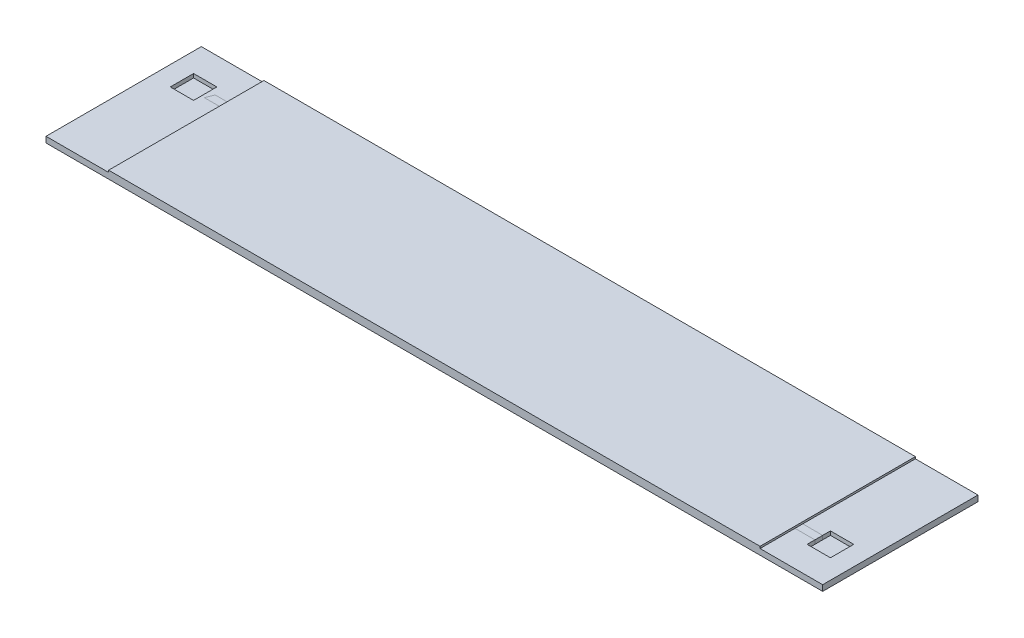
ISO-10303-21;
HEADER;
FILE_DESCRIPTION(('STEP AP214'),'2;1');
FILE_NAME('part.step','',(''),(''),'','','');
FILE_SCHEMA(('AUTOMOTIVE_DESIGN { 1 0 10303 214 1 1 1 1 }'));
ENDSEC;
DATA;
#1=APPLICATION_CONTEXT('core data for automotive mechanical design processes');
#2=APPLICATION_PROTOCOL_DEFINITION('international standard','automotive_design',2000,#1);
#3=PRODUCT_CONTEXT('',#1,'mechanical');
#4=PRODUCT('Part','Part','',(#3));
#5=PRODUCT_RELATED_PRODUCT_CATEGORY('part','',(#4));
#6=PRODUCT_DEFINITION_FORMATION('','',#4);
#7=PRODUCT_DEFINITION_CONTEXT('part definition',#1,'design');
#8=PRODUCT_DEFINITION('design','',#6,#7);
#9=PRODUCT_DEFINITION_SHAPE('','',#8);
#10=(LENGTH_UNIT() NAMED_UNIT(*) SI_UNIT(.MILLI.,.METRE.));
#11=(NAMED_UNIT(*) PLANE_ANGLE_UNIT() SI_UNIT($,.RADIAN.));
#12=(NAMED_UNIT(*) SI_UNIT($,.STERADIAN.) SOLID_ANGLE_UNIT());
#13=UNCERTAINTY_MEASURE_WITH_UNIT(LENGTH_MEASURE(1.E-05),#10,'distance_accuracy_value','');
#14=(GEOMETRIC_REPRESENTATION_CONTEXT(3) GLOBAL_UNCERTAINTY_ASSIGNED_CONTEXT((#13)) GLOBAL_UNIT_ASSIGNED_CONTEXT((#10,
#11,#12)) REPRESENTATION_CONTEXT('',''));
#15=CARTESIAN_POINT('',(0.,0.,0.));
#16=DIRECTION('',(0.,0.,1.));
#17=DIRECTION('',(1.,0.,0.));
#18=AXIS2_PLACEMENT_3D('',#15,#16,#17);
#19=CARTESIAN_POINT('',(-40.65,-0.25,4.50000000000002));
#20=DIRECTION('',(0.,0.,-1.));
#21=DIRECTION('',(-1.,0.,0.));
#22=AXIS2_PLACEMENT_3D('',#19,#20,#21);
#23=PLANE('',#22);
#24=DIRECTION('',(0.,1.,0.));
#25=VECTOR('',#24,1.);
#26=CARTESIAN_POINT('',(44.5,-0.25,4.50000000000002));
#27=LINE('',#26,#25);
#28=CARTESIAN_POINT('',(44.5,-0.25,4.50000000000002));
#29=VERTEX_POINT('',#28);
#30=CARTESIAN_POINT('',(44.5,0.25,4.50000000000002));
#31=VERTEX_POINT('',#30);
#32=EDGE_CURVE('E282',#29,#31,#27,.T.);
#33=ORIENTED_EDGE('',*,*,#32,.F.);
#34=DIRECTION('',(1.,0.,0.));
#35=VECTOR('',#34,1.);
#36=CARTESIAN_POINT('',(-40.65,-0.25,4.50000000000002));
#37=LINE('',#36,#35);
#38=CARTESIAN_POINT('',(-39.5,-0.25,4.50000000000002));
#39=VERTEX_POINT('',#38);
#40=EDGE_CURVE('E267',#39,#29,#37,.T.);
#41=ORIENTED_EDGE('',*,*,#40,.F.);
#42=DIRECTION('',(0.,-1.,0.));
#43=VECTOR('',#42,1.);
#44=CARTESIAN_POINT('',(-39.5,-0.25,4.50000000000002));
#45=LINE('',#44,#43);
#46=CARTESIAN_POINT('',(-39.5,0.25,4.50000000000002));
#47=VERTEX_POINT('',#46);
#48=EDGE_CURVE('E262',#47,#39,#45,.T.);
#49=ORIENTED_EDGE('',*,*,#48,.F.);
#50=DIRECTION('',(1.,0.,0.));
#51=VECTOR('',#50,1.);
#52=CARTESIAN_POINT('',(-40.65,0.25,4.50000000000002));
#53=LINE('',#52,#51);
#54=EDGE_CURVE('E284',#47,#31,#53,.T.);
#55=ORIENTED_EDGE('',*,*,#54,.T.);
#56=EDGE_LOOP('',(#33,#41,#49,#55));
#57=FACE_BOUND('',#56,.T.);
#58=ADVANCED_FACE('F45',(#57),#23,.T.);
#59=CARTESIAN_POINT('',(-40.65,0.25,5.50000000000002));
#60=DIRECTION('',(0.,1.,0.));
#61=DIRECTION('',(0.,0.,1.));
#62=AXIS2_PLACEMENT_3D('',#59,#60,#61);
#63=PLANE('',#62);
#64=DIRECTION('',(0.,0.,1.));
#65=VECTOR('',#64,1.);
#66=CARTESIAN_POINT('',(44.5,0.25,5.50000000000002));
#67=LINE('',#66,#65);
#68=CARTESIAN_POINT('',(44.5,0.25,5.50000000000002));
#69=VERTEX_POINT('',#68);
#70=EDGE_CURVE('E393',#31,#69,#67,.T.);
#71=ORIENTED_EDGE('',*,*,#70,.F.);
#72=ORIENTED_EDGE('',*,*,#54,.F.);
#73=DIRECTION('',(0.707106781186548,0.,-0.707106781186548));
#74=VECTOR('',#73,1.);
#75=CARTESIAN_POINT('',(-37.425,0.25,2.42500000000002));
#76=LINE('',#75,#74);
#77=CARTESIAN_POINT('',(-40.5,0.25,5.50000000000002));
#78=VERTEX_POINT('',#77);
#79=EDGE_CURVE('E243',#78,#47,#76,.T.);
#80=ORIENTED_EDGE('',*,*,#79,.F.);
#81=DIRECTION('',(1.,0.,0.));
#82=VECTOR('',#81,1.);
#83=CARTESIAN_POINT('',(-40.65,0.25,5.50000000000002));
#84=LINE('',#83,#82);
#85=EDGE_CURVE('E281',#78,#69,#84,.T.);
#86=ORIENTED_EDGE('',*,*,#85,.T.);
#87=EDGE_LOOP('',(#71,#72,#80,#86));
#88=FACE_BOUND('',#87,.T.);
#89=ADVANCED_FACE('F383',(#88),#63,.T.);
#90=CARTESIAN_POINT('',(-40.65,-0.25,5.50000000000002));
#91=DIRECTION('',(0.,0.,1.));
#92=DIRECTION('',(1.,0.,0.));
#93=AXIS2_PLACEMENT_3D('',#90,#91,#92);
#94=PLANE('',#93);
#95=DIRECTION('',(0.,-1.,0.));
#96=VECTOR('',#95,1.);
#97=CARTESIAN_POINT('',(44.5,-0.25,5.50000000000002));
#98=LINE('',#97,#96);
#99=CARTESIAN_POINT('',(44.5,-0.25,5.50000000000002));
#100=VERTEX_POINT('',#99);
#101=EDGE_CURVE('E59',#69,#100,#98,.T.);
#102=ORIENTED_EDGE('',*,*,#101,.F.);
#103=ORIENTED_EDGE('',*,*,#85,.F.);
#104=DIRECTION('',(0.,1.,0.));
#105=VECTOR('',#104,1.);
#106=CARTESIAN_POINT('',(-40.5,-0.25,5.50000000000002));
#107=LINE('',#106,#105);
#108=CARTESIAN_POINT('',(-40.5,-0.25,5.50000000000002));
#109=VERTEX_POINT('',#108);
#110=EDGE_CURVE('E256',#109,#78,#107,.T.);
#111=ORIENTED_EDGE('',*,*,#110,.F.);
#112=DIRECTION('',(1.,0.,0.));
#113=VECTOR('',#112,1.);
#114=CARTESIAN_POINT('',(-40.65,-0.25,5.50000000000002));
#115=LINE('',#114,#113);
#116=EDGE_CURVE('E278',#109,#100,#115,.T.);
#117=ORIENTED_EDGE('',*,*,#116,.T.);
#118=EDGE_LOOP('',(#102,#103,#111,#117));
#119=FACE_BOUND('',#118,.T.);
#120=ADVANCED_FACE('F385',(#119),#94,.T.);
#121=CARTESIAN_POINT('',(-40.65,-0.25,5.50000000000002));
#122=DIRECTION('',(0.,-1.,0.));
#123=DIRECTION('',(0.,0.,-1.));
#124=AXIS2_PLACEMENT_3D('',#121,#122,#123);
#125=PLANE('',#124);
#126=DIRECTION('',(0.,0.,-1.));
#127=VECTOR('',#126,1.);
#128=CARTESIAN_POINT('',(44.5,-0.25,5.50000000000002));
#129=LINE('',#128,#127);
#130=EDGE_CURVE('E12',#100,#29,#129,.T.);
#131=ORIENTED_EDGE('',*,*,#130,.F.);
#132=ORIENTED_EDGE('',*,*,#116,.F.);
#133=DIRECTION('',(-0.707106781186548,0.,0.707106781186548));
#134=VECTOR('',#133,1.);
#135=CARTESIAN_POINT('',(-37.425,-0.25,2.42500000000002));
#136=LINE('',#135,#134);
#137=EDGE_CURVE('E259',#39,#109,#136,.T.);
#138=ORIENTED_EDGE('',*,*,#137,.F.);
#139=ORIENTED_EDGE('',*,*,#40,.T.);
#140=EDGE_LOOP('',(#131,#132,#138,#139));
#141=FACE_BOUND('',#140,.T.);
#142=ADVANCED_FACE('F47',(#141),#125,.T.);
#143=CARTESIAN_POINT('',(-40.5,-0.25,-0.649999999999984));
#144=DIRECTION('',(0.,-1.,0.));
#145=DIRECTION('',(0.,0.,-1.));
#146=AXIS2_PLACEMENT_3D('',#143,#144,#145);
#147=PLANE('',#146);
#148=DIRECTION('',(0.,0.,1.));
#149=VECTOR('',#148,1.);
#150=CARTESIAN_POINT('',(-39.5,-0.25,-0.649999999999984));
#151=LINE('',#150,#149);
#152=CARTESIAN_POINT('',(-39.5,-0.25,0.500000000000019));
#153=VERTEX_POINT('',#152);
#154=EDGE_CURVE('E273',#153,#39,#151,.T.);
#155=ORIENTED_EDGE('',*,*,#154,.T.);
#156=ORIENTED_EDGE('',*,*,#137,.T.);
#157=DIRECTION('',(0.,0.,1.));
#158=VECTOR('',#157,1.);
#159=CARTESIAN_POINT('',(-40.5,-0.25,-0.649999999999984));
#160=LINE('',#159,#158);
#161=CARTESIAN_POINT('',(-40.5,-0.25,-0.499999999999982));
#162=VERTEX_POINT('',#161);
#163=EDGE_CURVE('E263',#162,#109,#160,.T.);
#164=ORIENTED_EDGE('',*,*,#163,.F.);
#165=DIRECTION('',(-0.707106781186548,0.,-0.707106781186547));
#166=VECTOR('',#165,1.);
#167=CARTESIAN_POINT('',(0.0750000000000056,-0.25,40.075));
#168=LINE('',#167,#166);
#169=EDGE_CURVE('E235',#153,#162,#168,.T.);
#170=ORIENTED_EDGE('',*,*,#169,.F.);
#171=EDGE_LOOP('',(#155,#156,#164,#170));
#172=FACE_BOUND('',#171,.T.);
#173=ADVANCED_FACE('F299',(#172),#147,.T.);
#174=CARTESIAN_POINT('',(-40.5,-0.25,-0.649999999999984));
#175=DIRECTION('',(-1.,0.,0.));
#176=DIRECTION('',(0.,0.,1.));
#177=AXIS2_PLACEMENT_3D('',#174,#175,#176);
#178=PLANE('',#177);
#179=ORIENTED_EDGE('',*,*,#163,.T.);
#180=ORIENTED_EDGE('',*,*,#110,.T.);
#181=DIRECTION('',(0.,0.,1.));
#182=VECTOR('',#181,1.);
#183=CARTESIAN_POINT('',(-40.5,0.25,-0.649999999999984));
#184=LINE('',#183,#182);
#185=CARTESIAN_POINT('',(-40.5,0.25,-0.499999999999984));
#186=VERTEX_POINT('',#185);
#187=EDGE_CURVE('E266',#186,#78,#184,.T.);
#188=ORIENTED_EDGE('',*,*,#187,.F.);
#189=DIRECTION('',(0.,1.,0.));
#190=VECTOR('',#189,1.);
#191=CARTESIAN_POINT('',(-40.5,-0.25,-0.499999999999981));
#192=LINE('',#191,#190);
#193=EDGE_CURVE('E232',#162,#186,#192,.T.);
#194=ORIENTED_EDGE('',*,*,#193,.F.);
#195=EDGE_LOOP('',(#179,#180,#188,#194));
#196=FACE_BOUND('',#195,.T.);
#197=ADVANCED_FACE('F374',(#196),#178,.T.);
#198=CARTESIAN_POINT('',(-40.5,0.25,-0.649999999999984));
#199=DIRECTION('',(0.,1.,0.));
#200=DIRECTION('',(0.,0.,1.));
#201=AXIS2_PLACEMENT_3D('',#198,#199,#200);
#202=PLANE('',#201);
#203=ORIENTED_EDGE('',*,*,#187,.T.);
#204=ORIENTED_EDGE('',*,*,#79,.T.);
#205=DIRECTION('',(0.,0.,1.));
#206=VECTOR('',#205,1.);
#207=CARTESIAN_POINT('',(-39.5,0.25,-0.649999999999984));
#208=LINE('',#207,#206);
#209=CARTESIAN_POINT('',(-39.5,0.25,0.500000000000019));
#210=VERTEX_POINT('',#209);
#211=EDGE_CURVE('E270',#210,#47,#208,.T.);
#212=ORIENTED_EDGE('',*,*,#211,.F.);
#213=DIRECTION('',(0.707106781186548,0.,0.707106781186547));
#214=VECTOR('',#213,1.);
#215=CARTESIAN_POINT('',(0.0750000000000056,0.25,40.075));
#216=LINE('',#215,#214);
#217=EDGE_CURVE('E219',#186,#210,#216,.T.);
#218=ORIENTED_EDGE('',*,*,#217,.F.);
#219=EDGE_LOOP('',(#203,#204,#212,#218));
#220=FACE_BOUND('',#219,.T.);
#221=ADVANCED_FACE('F371',(#220),#202,.T.);
#222=CARTESIAN_POINT('',(-39.5,-0.25,-0.649999999999984));
#223=DIRECTION('',(1.,0.,0.));
#224=DIRECTION('',(0.,0.,-1.));
#225=AXIS2_PLACEMENT_3D('',#222,#223,#224);
#226=PLANE('',#225);
#227=ORIENTED_EDGE('',*,*,#211,.T.);
#228=ORIENTED_EDGE('',*,*,#48,.T.);
#229=ORIENTED_EDGE('',*,*,#154,.F.);
#230=DIRECTION('',(0.,-1.,0.));
#231=VECTOR('',#230,1.);
#232=CARTESIAN_POINT('',(-39.5,-0.25,0.500000000000019));
#233=LINE('',#232,#231);
#234=EDGE_CURVE('E238',#210,#153,#233,.T.);
#235=ORIENTED_EDGE('',*,*,#234,.F.);
#236=EDGE_LOOP('',(#227,#228,#229,#235));
#237=FACE_BOUND('',#236,.T.);
#238=ADVANCED_FACE('F296',(#237),#226,.T.);
#239=CARTESIAN_POINT('',(40.65,-0.25,-0.499999999999999));
#240=DIRECTION('',(0.,-1.,0.));
#241=DIRECTION('',(0.,0.,-1.));
#242=AXIS2_PLACEMENT_3D('',#239,#240,#241);
#243=PLANE('',#242);
#244=DIRECTION('',(-1.,0.,0.));
#245=VECTOR('',#244,1.);
#246=CARTESIAN_POINT('',(40.65,-0.25,0.500000000000001));
#247=LINE('',#246,#245);
#248=CARTESIAN_POINT('',(40.5,-0.25,0.500000000000001));
#249=VERTEX_POINT('',#248);
#250=EDGE_CURVE('E249',#249,#153,#247,.T.);
#251=ORIENTED_EDGE('',*,*,#250,.T.);
#252=ORIENTED_EDGE('',*,*,#169,.T.);
#253=DIRECTION('',(-1.,0.,0.));
#254=VECTOR('',#253,1.);
#255=CARTESIAN_POINT('',(40.65,-0.25,-0.499999999999999));
#256=LINE('',#255,#254);
#257=CARTESIAN_POINT('',(39.5,-0.25,-0.499999999999999));
#258=VERTEX_POINT('',#257);
#259=EDGE_CURVE('E239',#258,#162,#256,.T.);
#260=ORIENTED_EDGE('',*,*,#259,.F.);
#261=DIRECTION('',(-0.707106781186548,0.,-0.707106781186547));
#262=VECTOR('',#261,1.);
#263=CARTESIAN_POINT('',(36.925,-0.25,-3.075));
#264=LINE('',#263,#262);
#265=EDGE_CURVE('E211',#249,#258,#264,.T.);
#266=ORIENTED_EDGE('',*,*,#265,.F.);
#267=EDGE_LOOP('',(#251,#252,#260,#266));
#268=FACE_BOUND('',#267,.T.);
#269=ADVANCED_FACE('F303',(#268),#243,.T.);
#270=CARTESIAN_POINT('',(40.65,-0.25,-0.499999999999999));
#271=DIRECTION('',(0.,0.,-1.));
#272=DIRECTION('',(-1.,0.,0.));
#273=AXIS2_PLACEMENT_3D('',#270,#271,#272);
#274=PLANE('',#273);
#275=ORIENTED_EDGE('',*,*,#259,.T.);
#276=ORIENTED_EDGE('',*,*,#193,.T.);
#277=DIRECTION('',(-1.,0.,0.));
#278=VECTOR('',#277,1.);
#279=CARTESIAN_POINT('',(40.65,0.25,-0.499999999999999));
#280=LINE('',#279,#278);
#281=CARTESIAN_POINT('',(39.5,0.25,-0.500000000000001));
#282=VERTEX_POINT('',#281);
#283=EDGE_CURVE('E242',#282,#186,#280,.T.);
#284=ORIENTED_EDGE('',*,*,#283,.F.);
#285=DIRECTION('',(0.,1.,0.));
#286=VECTOR('',#285,1.);
#287=CARTESIAN_POINT('',(39.5,-0.25,-0.5));
#288=LINE('',#287,#286);
#289=EDGE_CURVE('E208',#258,#282,#288,.T.);
#290=ORIENTED_EDGE('',*,*,#289,.F.);
#291=EDGE_LOOP('',(#275,#276,#284,#290));
#292=FACE_BOUND('',#291,.T.);
#293=ADVANCED_FACE('F306',(#292),#274,.T.);
#294=CARTESIAN_POINT('',(40.65,0.25,-0.499999999999999));
#295=DIRECTION('',(0.,1.,0.));
#296=DIRECTION('',(0.,0.,1.));
#297=AXIS2_PLACEMENT_3D('',#294,#295,#296);
#298=PLANE('',#297);
#299=ORIENTED_EDGE('',*,*,#283,.T.);
#300=ORIENTED_EDGE('',*,*,#217,.T.);
#301=DIRECTION('',(-1.,0.,0.));
#302=VECTOR('',#301,1.);
#303=CARTESIAN_POINT('',(40.65,0.25,0.500000000000001));
#304=LINE('',#303,#302);
#305=CARTESIAN_POINT('',(40.5,0.25,0.500000000000001));
#306=VERTEX_POINT('',#305);
#307=EDGE_CURVE('E246',#306,#210,#304,.T.);
#308=ORIENTED_EDGE('',*,*,#307,.F.);
#309=DIRECTION('',(0.707106781186548,0.,0.707106781186547));
#310=VECTOR('',#309,1.);
#311=CARTESIAN_POINT('',(36.925,0.25,-3.075));
#312=LINE('',#311,#310);
#313=EDGE_CURVE('E195',#282,#306,#312,.T.);
#314=ORIENTED_EDGE('',*,*,#313,.F.);
#315=EDGE_LOOP('',(#299,#300,#308,#314));
#316=FACE_BOUND('',#315,.T.);
#317=ADVANCED_FACE('F360',(#316),#298,.T.);
#318=CARTESIAN_POINT('',(40.65,-0.25,0.500000000000001));
#319=DIRECTION('',(0.,0.,1.));
#320=DIRECTION('',(1.,0.,0.));
#321=AXIS2_PLACEMENT_3D('',#318,#319,#320);
#322=PLANE('',#321);
#323=ORIENTED_EDGE('',*,*,#307,.T.);
#324=ORIENTED_EDGE('',*,*,#234,.T.);
#325=ORIENTED_EDGE('',*,*,#250,.F.);
#326=DIRECTION('',(0.,-1.,0.));
#327=VECTOR('',#326,1.);
#328=CARTESIAN_POINT('',(40.5,-0.25,0.500000000000001));
#329=LINE('',#328,#327);
#330=EDGE_CURVE('E214',#306,#249,#329,.T.);
#331=ORIENTED_EDGE('',*,*,#330,.F.);
#332=EDGE_LOOP('',(#323,#324,#325,#331));
#333=FACE_BOUND('',#332,.T.);
#334=ADVANCED_FACE('F357',(#333),#322,.T.);
#335=CARTESIAN_POINT('',(39.5,-0.25,-5.65000000000001));
#336=DIRECTION('',(0.,-1.,0.));
#337=DIRECTION('',(0.,0.,-1.));
#338=AXIS2_PLACEMENT_3D('',#335,#336,#337);
#339=PLANE('',#338);
#340=DIRECTION('',(0.,0.,1.));
#341=VECTOR('',#340,1.);
#342=CARTESIAN_POINT('',(40.5,-0.25,-5.65000000000001));
#343=LINE('',#342,#341);
#344=CARTESIAN_POINT('',(40.5,-0.25,-5.5));
#345=VERTEX_POINT('',#344);
#346=EDGE_CURVE('E225',#345,#249,#343,.T.);
#347=ORIENTED_EDGE('',*,*,#346,.T.);
#348=ORIENTED_EDGE('',*,*,#265,.T.);
#349=DIRECTION('',(0.,0.,1.));
#350=VECTOR('',#349,1.);
#351=CARTESIAN_POINT('',(39.5,-0.25,-5.65000000000001));
#352=LINE('',#351,#350);
#353=CARTESIAN_POINT('',(39.5,-0.25,-4.5));
#354=VERTEX_POINT('',#353);
#355=EDGE_CURVE('E215',#354,#258,#352,.T.);
#356=ORIENTED_EDGE('',*,*,#355,.F.);
#357=DIRECTION('',(-0.707106781186548,0.,0.707106781186548));
#358=VECTOR('',#357,1.);
#359=CARTESIAN_POINT('',(-0.250000000000007,-0.25,35.25));
#360=LINE('',#359,#358);
#361=EDGE_CURVE('E186',#345,#354,#360,.T.);
#362=ORIENTED_EDGE('',*,*,#361,.F.);
#363=EDGE_LOOP('',(#347,#348,#356,#362));
#364=FACE_BOUND('',#363,.T.);
#365=ADVANCED_FACE('F332',(#364),#339,.T.);
#366=CARTESIAN_POINT('',(39.5,-0.25,-5.65000000000001));
#367=DIRECTION('',(-1.,0.,0.));
#368=DIRECTION('',(0.,0.,1.));
#369=AXIS2_PLACEMENT_3D('',#366,#367,#368);
#370=PLANE('',#369);
#371=ORIENTED_EDGE('',*,*,#355,.T.);
#372=ORIENTED_EDGE('',*,*,#289,.T.);
#373=DIRECTION('',(0.,0.,1.));
#374=VECTOR('',#373,1.);
#375=CARTESIAN_POINT('',(39.5,0.25,-5.65000000000001));
#376=LINE('',#375,#374);
#377=CARTESIAN_POINT('',(39.5,0.25,-4.50000000000001));
#378=VERTEX_POINT('',#377);
#379=EDGE_CURVE('E218',#378,#282,#376,.T.);
#380=ORIENTED_EDGE('',*,*,#379,.F.);
#381=DIRECTION('',(0.,1.,0.));
#382=VECTOR('',#381,1.);
#383=CARTESIAN_POINT('',(39.5,-0.25,-4.5));
#384=LINE('',#383,#382);
#385=EDGE_CURVE('E189',#354,#378,#384,.T.);
#386=ORIENTED_EDGE('',*,*,#385,.F.);
#387=EDGE_LOOP('',(#371,#372,#380,#386));
#388=FACE_BOUND('',#387,.T.);
#389=ADVANCED_FACE('F310',(#388),#370,.T.);
#390=CARTESIAN_POINT('',(39.5,0.25,-5.65000000000001));
#391=DIRECTION('',(0.,1.,0.));
#392=DIRECTION('',(0.,0.,1.));
#393=AXIS2_PLACEMENT_3D('',#390,#391,#392);
#394=PLANE('',#393);
#395=ORIENTED_EDGE('',*,*,#379,.T.);
#396=ORIENTED_EDGE('',*,*,#313,.T.);
#397=DIRECTION('',(0.,0.,1.));
#398=VECTOR('',#397,1.);
#399=CARTESIAN_POINT('',(40.5,0.25,-5.65000000000001));
#400=LINE('',#399,#398);
#401=CARTESIAN_POINT('',(40.5,0.25,-5.5));
#402=VERTEX_POINT('',#401);
#403=EDGE_CURVE('E222',#402,#306,#400,.T.);
#404=ORIENTED_EDGE('',*,*,#403,.F.);
#405=DIRECTION('',(0.707106781186548,0.,-0.707106781186548));
#406=VECTOR('',#405,1.);
#407=CARTESIAN_POINT('',(-0.250000000000007,0.25,35.25));
#408=LINE('',#407,#406);
#409=EDGE_CURVE('E192',#378,#402,#408,.T.);
#410=ORIENTED_EDGE('',*,*,#409,.F.);
#411=EDGE_LOOP('',(#395,#396,#404,#410));
#412=FACE_BOUND('',#411,.T.);
#413=ADVANCED_FACE('F313',(#412),#394,.T.);
#414=CARTESIAN_POINT('',(40.5,-0.25,-5.65000000000001));
#415=DIRECTION('',(1.,0.,0.));
#416=DIRECTION('',(0.,0.,-1.));
#417=AXIS2_PLACEMENT_3D('',#414,#415,#416);
#418=PLANE('',#417);
#419=ORIENTED_EDGE('',*,*,#403,.T.);
#420=ORIENTED_EDGE('',*,*,#330,.T.);
#421=ORIENTED_EDGE('',*,*,#346,.F.);
#422=DIRECTION('',(0.,-1.,0.));
#423=VECTOR('',#422,1.);
#424=CARTESIAN_POINT('',(40.5,-0.25,-5.5));
#425=LINE('',#424,#423);
#426=EDGE_CURVE('E182',#402,#345,#425,.T.);
#427=ORIENTED_EDGE('',*,*,#426,.F.);
#428=EDGE_LOOP('',(#419,#420,#421,#427));
#429=FACE_BOUND('',#428,.T.);
#430=ADVANCED_FACE('F347',(#429),#418,.T.);
#431=CARTESIAN_POINT('',(-46.,-0.25,-5.5));
#432=DIRECTION('',(0.,0.,-1.));
#433=DIRECTION('',(-1.,0.,0.));
#434=AXIS2_PLACEMENT_3D('',#431,#432,#433);
#435=PLANE('',#434);
#436=DIRECTION('',(0.,-1.,0.));
#437=VECTOR('',#436,1.);
#438=CARTESIAN_POINT('',(-44.5,-0.25,-5.5));
#439=LINE('',#438,#437);
#440=CARTESIAN_POINT('',(-44.5,0.25,-5.5));
#441=VERTEX_POINT('',#440);
#442=CARTESIAN_POINT('',(-44.5,-0.25,-5.5));
#443=VERTEX_POINT('',#442);
#444=EDGE_CURVE('E67',#441,#443,#439,.T.);
#445=ORIENTED_EDGE('',*,*,#444,.F.);
#446=DIRECTION('',(1.,0.,0.));
#447=VECTOR('',#446,1.);
#448=CARTESIAN_POINT('',(-46.,0.25,-5.5));
#449=LINE('',#448,#447);
#450=CARTESIAN_POINT('',(-40.,0.25,-5.5));
#451=VERTEX_POINT('',#450);
#452=EDGE_CURVE('E176',#441,#451,#449,.T.);
#453=ORIENTED_EDGE('',*,*,#452,.T.);
#454=DIRECTION('',(0.,1.,0.));
#455=VECTOR('',#454,1.);
#456=CARTESIAN_POINT('',(-40.,-0.25,-5.5));
#457=LINE('',#456,#455);
#458=CARTESIAN_POINT('',(-40.,-0.25,-5.5));
#459=VERTEX_POINT('',#458);
#460=EDGE_CURVE('E178',#459,#451,#457,.T.);
#461=ORIENTED_EDGE('',*,*,#460,.F.);
#462=DIRECTION('',(1.,0.,0.));
#463=VECTOR('',#462,1.);
#464=CARTESIAN_POINT('',(-46.,-0.25,-5.5));
#465=LINE('',#464,#463);
#466=EDGE_CURVE('E150',#443,#459,#465,.T.);
#467=ORIENTED_EDGE('',*,*,#466,.F.);
#468=EDGE_LOOP('',(#445,#453,#461,#467));
#469=FACE_BOUND('',#468,.T.);
#470=ADVANCED_FACE('F325',(#469),#435,.T.);
#471=CARTESIAN_POINT('',(-46.,0.25,-4.5));
#472=DIRECTION('',(0.,1.,0.));
#473=DIRECTION('',(0.,0.,1.));
#474=AXIS2_PLACEMENT_3D('',#471,#472,#473);
#475=PLANE('',#474);
#476=DIRECTION('',(0.,0.,1.));
#477=VECTOR('',#476,1.);
#478=CARTESIAN_POINT('',(-40.,0.25,-4.5));
#479=LINE('',#478,#477);
#480=CARTESIAN_POINT('',(-40.,0.25,-4.5));
#481=VERTEX_POINT('',#480);
#482=EDGE_CURVE('E173',#451,#481,#479,.T.);
#483=ORIENTED_EDGE('',*,*,#482,.F.);
#484=ORIENTED_EDGE('',*,*,#452,.F.);
#485=DIRECTION('',(0.,0.,-1.));
#486=VECTOR('',#485,1.);
#487=CARTESIAN_POINT('',(-44.5,0.25,-4.5));
#488=LINE('',#487,#486);
#489=CARTESIAN_POINT('',(-44.5,0.25,-4.5));
#490=VERTEX_POINT('',#489);
#491=EDGE_CURVE('E158',#490,#441,#488,.T.);
#492=ORIENTED_EDGE('',*,*,#491,.F.);
#493=DIRECTION('',(1.,0.,0.));
#494=VECTOR('',#493,1.);
#495=CARTESIAN_POINT('',(-46.,0.25,-4.5));
#496=LINE('',#495,#494);
#497=EDGE_CURVE('E157',#490,#481,#496,.T.);
#498=ORIENTED_EDGE('',*,*,#497,.T.);
#499=EDGE_LOOP('',(#483,#484,#492,#498));
#500=FACE_BOUND('',#499,.T.);
#501=ADVANCED_FACE('F328',(#500),#475,.T.);
#502=CARTESIAN_POINT('',(-46.,-0.25,-4.5));
#503=DIRECTION('',(0.,0.,1.));
#504=DIRECTION('',(1.,0.,0.));
#505=AXIS2_PLACEMENT_3D('',#502,#503,#504);
#506=PLANE('',#505);
#507=DIRECTION('',(0.,1.,0.));
#508=VECTOR('',#507,1.);
#509=CARTESIAN_POINT('',(-44.5,-0.25,-4.5));
#510=LINE('',#509,#508);
#511=CARTESIAN_POINT('',(-44.5,-0.25,-4.5));
#512=VERTEX_POINT('',#511);
#513=EDGE_CURVE('E145',#512,#490,#510,.T.);
#514=ORIENTED_EDGE('',*,*,#513,.F.);
#515=DIRECTION('',(1.,0.,0.));
#516=VECTOR('',#515,1.);
#517=CARTESIAN_POINT('',(-46.,-0.25,-4.5));
#518=LINE('',#517,#516);
#519=CARTESIAN_POINT('',(-40.,-0.25,-4.5));
#520=VERTEX_POINT('',#519);
#521=EDGE_CURVE('E155',#512,#520,#518,.T.);
#522=ORIENTED_EDGE('',*,*,#521,.T.);
#523=DIRECTION('',(0.,-1.,0.));
#524=VECTOR('',#523,1.);
#525=CARTESIAN_POINT('',(-40.,-0.25,-4.5));
#526=LINE('',#525,#524);
#527=EDGE_CURVE('E165',#481,#520,#526,.T.);
#528=ORIENTED_EDGE('',*,*,#527,.F.);
#529=ORIENTED_EDGE('',*,*,#497,.F.);
#530=EDGE_LOOP('',(#514,#522,#528,#529));
#531=FACE_BOUND('',#530,.T.);
#532=ADVANCED_FACE('F153',(#531),#506,.T.);
#533=CARTESIAN_POINT('',(-46.,-0.25,-4.5));
#534=DIRECTION('',(0.,-1.,0.));
#535=DIRECTION('',(0.,0.,-1.));
#536=AXIS2_PLACEMENT_3D('',#533,#534,#535);
#537=PLANE('',#536);
#538=DIRECTION('',(0.,0.,1.));
#539=VECTOR('',#538,1.);
#540=CARTESIAN_POINT('',(-44.5,-0.25,-4.5));
#541=LINE('',#540,#539);
#542=EDGE_CURVE('E53',#443,#512,#541,.T.);
#543=ORIENTED_EDGE('',*,*,#542,.F.);
#544=ORIENTED_EDGE('',*,*,#466,.T.);
#545=DIRECTION('',(0.,0.,-1.));
#546=VECTOR('',#545,1.);
#547=CARTESIAN_POINT('',(-40.,-0.25,-4.5));
#548=LINE('',#547,#546);
#549=EDGE_CURVE('E163',#520,#459,#548,.T.);
#550=ORIENTED_EDGE('',*,*,#549,.F.);
#551=ORIENTED_EDGE('',*,*,#521,.F.);
#552=EDGE_LOOP('',(#543,#544,#550,#551));
#553=FACE_BOUND('',#552,.T.);
#554=ADVANCED_FACE('F161',(#553),#537,.T.);
#555=CARTESIAN_POINT('',(-40.,-0.25,-5.5));
#556=DIRECTION('',(0.,0.,-1.));
#557=DIRECTION('',(-1.,0.,0.));
#558=AXIS2_PLACEMENT_3D('',#555,#556,#557);
#559=PLANE('',#558);
#560=DIRECTION('',(1.,0.,0.));
#561=VECTOR('',#560,1.);
#562=CARTESIAN_POINT('',(-40.,0.25,-5.5));
#563=LINE('',#562,#561);
#564=EDGE_CURVE('E201',#451,#402,#563,.T.);
#565=ORIENTED_EDGE('',*,*,#564,.T.);
#566=ORIENTED_EDGE('',*,*,#426,.T.);
#567=DIRECTION('',(1.,0.,0.));
#568=VECTOR('',#567,1.);
#569=CARTESIAN_POINT('',(-40.,-0.25,-5.5));
#570=LINE('',#569,#568);
#571=EDGE_CURVE('E168',#459,#345,#570,.T.);
#572=ORIENTED_EDGE('',*,*,#571,.F.);
#573=ORIENTED_EDGE('',*,*,#460,.T.);
#574=EDGE_LOOP('',(#565,#566,#572,#573));
#575=FACE_BOUND('',#574,.T.);
#576=ADVANCED_FACE('F321',(#575),#559,.T.);
#577=CARTESIAN_POINT('',(-40.,0.25,-4.5));
#578=DIRECTION('',(0.,1.,0.));
#579=DIRECTION('',(0.,0.,1.));
#580=AXIS2_PLACEMENT_3D('',#577,#578,#579);
#581=PLANE('',#580);
#582=DIRECTION('',(1.,0.,0.));
#583=VECTOR('',#582,1.);
#584=CARTESIAN_POINT('',(-40.,0.25,-4.5));
#585=LINE('',#584,#583);
#586=EDGE_CURVE('E198',#481,#378,#585,.T.);
#587=ORIENTED_EDGE('',*,*,#586,.T.);
#588=ORIENTED_EDGE('',*,*,#409,.T.);
#589=ORIENTED_EDGE('',*,*,#564,.F.);
#590=ORIENTED_EDGE('',*,*,#482,.T.);
#591=EDGE_LOOP('',(#587,#588,#589,#590));
#592=FACE_BOUND('',#591,.T.);
#593=ADVANCED_FACE('F317',(#592),#581,.T.);
#594=CARTESIAN_POINT('',(-40.,-0.25,-4.5));
#595=DIRECTION('',(0.,0.,1.));
#596=DIRECTION('',(1.,0.,0.));
#597=AXIS2_PLACEMENT_3D('',#594,#595,#596);
#598=PLANE('',#597);
#599=DIRECTION('',(1.,0.,0.));
#600=VECTOR('',#599,1.);
#601=CARTESIAN_POINT('',(-40.,-0.25,-4.5));
#602=LINE('',#601,#600);
#603=EDGE_CURVE('E185',#520,#354,#602,.T.);
#604=ORIENTED_EDGE('',*,*,#603,.T.);
#605=ORIENTED_EDGE('',*,*,#385,.T.);
#606=ORIENTED_EDGE('',*,*,#586,.F.);
#607=ORIENTED_EDGE('',*,*,#527,.T.);
#608=EDGE_LOOP('',(#604,#605,#606,#607));
#609=FACE_BOUND('',#608,.T.);
#610=ADVANCED_FACE('F330',(#609),#598,.T.);
#611=CARTESIAN_POINT('',(-40.,-0.25,-4.5));
#612=DIRECTION('',(0.,-1.,0.));
#613=DIRECTION('',(0.,0.,-1.));
#614=AXIS2_PLACEMENT_3D('',#611,#612,#613);
#615=PLANE('',#614);
#616=ORIENTED_EDGE('',*,*,#571,.T.);
#617=ORIENTED_EDGE('',*,*,#361,.T.);
#618=ORIENTED_EDGE('',*,*,#603,.F.);
#619=ORIENTED_EDGE('',*,*,#549,.T.);
#620=EDGE_LOOP('',(#616,#617,#618,#619));
#621=FACE_BOUND('',#620,.T.);
#622=ADVANCED_FACE('F335',(#621),#615,.T.);
#623=CARTESIAN_POINT('',(-44.5,-0.25,-3.49999999999998));
#624=DIRECTION('',(1.,0.,0.));
#625=DIRECTION('',(0.,0.,-1.));
#626=AXIS2_PLACEMENT_3D('',#623,#624,#625);
#627=PLANE('',#626);
#628=ORIENTED_EDGE('',*,*,#444,.T.);
#629=ORIENTED_EDGE('',*,*,#542,.T.);
#630=ORIENTED_EDGE('',*,*,#513,.T.);
#631=ORIENTED_EDGE('',*,*,#491,.T.);
#632=EDGE_LOOP('',(#628,#629,#630,#631));
#633=FACE_BOUND('',#632,.T.);
#634=ADVANCED_FACE('F144',(#633),#627,.F.);
#635=CARTESIAN_POINT('',(44.5,-0.25,6.50000000000002));
#636=DIRECTION('',(-1.,0.,0.));
#637=DIRECTION('',(0.,0.,1.));
#638=AXIS2_PLACEMENT_3D('',#635,#636,#637);
#639=PLANE('',#638);
#640=ORIENTED_EDGE('',*,*,#32,.T.);
#641=ORIENTED_EDGE('',*,*,#70,.T.);
#642=ORIENTED_EDGE('',*,*,#101,.T.);
#643=ORIENTED_EDGE('',*,*,#130,.T.);
#644=EDGE_LOOP('',(#640,#641,#642,#643));
#645=FACE_BOUND('',#644,.T.);
#646=ADVANCED_FACE('F342',(#645),#639,.F.);
#647=CLOSED_SHELL('',(#58,#89,#120,#142,#173,#197,#221,#238,#269,#293,#317,#334,#365,#389,#413,
#430,#470,#501,#532,#554,#576,#593,#610,#622,#634,#646));
#648=MANIFOLD_SOLID_BREP('B2',#647);
#649=CARTESIAN_POINT('',(0.,0.5,10.));
#650=DIRECTION('',(0.,0.,-1.));
#651=DIRECTION('',(-1.,0.,0.));
#652=AXIS2_PLACEMENT_3D('',#649,#650,#651);
#653=PLANE('',#652);
#654=DIRECTION('',(1.,0.,0.));
#655=VECTOR('',#654,1.);
#656=CARTESIAN_POINT('',(0.,0.5,10.));
#657=LINE('',#656,#655);
#658=CARTESIAN_POINT('',(-41.9376818081254,0.5,10.));
#659=VERTEX_POINT('',#658);
#660=CARTESIAN_POINT('',(41.9376818081254,0.5,10.));
#661=VERTEX_POINT('',#660);
#662=EDGE_CURVE('E692',#659,#661,#657,.T.);
#663=ORIENTED_EDGE('',*,*,#662,.F.);
#664=DIRECTION('',(0.,1.,0.));
#665=VECTOR('',#664,1.);
#666=CARTESIAN_POINT('',(-41.9376818081254,0.25,10.));
#667=LINE('',#666,#665);
#668=CARTESIAN_POINT('',(-41.9376818081254,0.25,10.));
#669=VERTEX_POINT('',#668);
#670=EDGE_CURVE('E682',#669,#659,#667,.T.);
#671=ORIENTED_EDGE('',*,*,#670,.F.);
#672=DIRECTION('',(1.,0.,0.));
#673=VECTOR('',#672,1.);
#674=CARTESIAN_POINT('',(-50.,0.25,10.));
#675=LINE('',#674,#673);
#676=CARTESIAN_POINT('',(-50.,0.25,10.));
#677=VERTEX_POINT('',#676);
#678=EDGE_CURVE('E670',#677,#669,#675,.T.);
#679=ORIENTED_EDGE('',*,*,#678,.F.);
#680=DIRECTION('',(0.,-1.,0.));
#681=VECTOR('',#680,1.);
#682=CARTESIAN_POINT('',(-50.,0.5,10.));
#683=LINE('',#682,#681);
#684=CARTESIAN_POINT('',(-50.,-0.5,10.));
#685=VERTEX_POINT('',#684);
#686=EDGE_CURVE('E579',#677,#685,#683,.T.);
#687=ORIENTED_EDGE('',*,*,#686,.T.);
#688=DIRECTION('',(1.,0.,0.));
#689=VECTOR('',#688,1.);
#690=CARTESIAN_POINT('',(0.,-0.5,10.));
#691=LINE('',#690,#689);
#692=CARTESIAN_POINT('',(50.,-0.5,10.));
#693=VERTEX_POINT('',#692);
#694=EDGE_CURVE('E746',#685,#693,#691,.T.);
#695=ORIENTED_EDGE('',*,*,#694,.T.);
#696=DIRECTION('',(0.,-1.,0.));
#697=VECTOR('',#696,1.);
#698=CARTESIAN_POINT('',(50.,0.5,10.));
#699=LINE('',#698,#697);
#700=CARTESIAN_POINT('',(50.,0.25,10.));
#701=VERTEX_POINT('',#700);
#702=EDGE_CURVE('E796',#701,#693,#699,.T.);
#703=ORIENTED_EDGE('',*,*,#702,.F.);
#704=DIRECTION('',(1.,0.,0.));
#705=VECTOR('',#704,1.);
#706=CARTESIAN_POINT('',(50.,0.25,10.));
#707=LINE('',#706,#705);
#708=CARTESIAN_POINT('',(41.9376818081254,0.25,10.));
#709=VERTEX_POINT('',#708);
#710=EDGE_CURVE('E722',#709,#701,#707,.T.);
#711=ORIENTED_EDGE('',*,*,#710,.F.);
#712=DIRECTION('',(0.,1.,0.));
#713=VECTOR('',#712,1.);
#714=CARTESIAN_POINT('',(41.9376818081254,0.25,10.));
#715=LINE('',#714,#713);
#716=EDGE_CURVE('E704',#709,#661,#715,.T.);
#717=ORIENTED_EDGE('',*,*,#716,.T.);
#718=EDGE_LOOP('',(#663,#671,#679,#687,#695,#703,#711,#717));
#719=FACE_BOUND('',#718,.T.);
#720=ADVANCED_FACE('F557',(#719),#653,.F.);
#721=CARTESIAN_POINT('',(0.,0.5,-10.));
#722=DIRECTION('',(0.,0.,-1.));
#723=DIRECTION('',(-1.,0.,0.));
#724=AXIS2_PLACEMENT_3D('',#721,#722,#723);
#725=PLANE('',#724);
#726=DIRECTION('',(0.,1.,0.));
#727=VECTOR('',#726,1.);
#728=CARTESIAN_POINT('',(-41.9376818081254,0.25,-10.));
#729=LINE('',#728,#727);
#730=CARTESIAN_POINT('',(-41.9376818081254,0.25,-10.));
#731=VERTEX_POINT('',#730);
#732=CARTESIAN_POINT('',(-41.9376818081254,0.5,-10.));
#733=VERTEX_POINT('',#732);
#734=EDGE_CURVE('E685',#731,#733,#729,.T.);
#735=ORIENTED_EDGE('',*,*,#734,.T.);
#736=DIRECTION('',(1.,0.,0.));
#737=VECTOR('',#736,1.);
#738=CARTESIAN_POINT('',(0.,0.5,-10.));
#739=LINE('',#738,#737);
#740=CARTESIAN_POINT('',(41.9376818081254,0.5,-10.));
#741=VERTEX_POINT('',#740);
#742=EDGE_CURVE('E778',#733,#741,#739,.T.);
#743=ORIENTED_EDGE('',*,*,#742,.T.);
#744=DIRECTION('',(0.,1.,0.));
#745=VECTOR('',#744,1.);
#746=CARTESIAN_POINT('',(41.9376818081254,0.25,-10.));
#747=LINE('',#746,#745);
#748=CARTESIAN_POINT('',(41.9376818081254,0.25,-10.));
#749=VERTEX_POINT('',#748);
#750=EDGE_CURVE('E707',#749,#741,#747,.T.);
#751=ORIENTED_EDGE('',*,*,#750,.F.);
#752=DIRECTION('',(-1.,0.,0.));
#753=VECTOR('',#752,1.);
#754=CARTESIAN_POINT('',(50.,0.25,-10.));
#755=LINE('',#754,#753);
#756=CARTESIAN_POINT('',(50.,0.25,-10.));
#757=VERTEX_POINT('',#756);
#758=EDGE_CURVE('E720',#757,#749,#755,.T.);
#759=ORIENTED_EDGE('',*,*,#758,.F.);
#760=DIRECTION('',(0.,-1.,0.));
#761=VECTOR('',#760,1.);
#762=CARTESIAN_POINT('',(50.,0.5,-10.));
#763=LINE('',#762,#761);
#764=CARTESIAN_POINT('',(50.,-0.5,-10.));
#765=VERTEX_POINT('',#764);
#766=EDGE_CURVE('E794',#757,#765,#763,.T.);
#767=ORIENTED_EDGE('',*,*,#766,.T.);
#768=DIRECTION('',(1.,0.,0.));
#769=VECTOR('',#768,1.);
#770=CARTESIAN_POINT('',(0.,-0.5,-10.));
#771=LINE('',#770,#769);
#772=CARTESIAN_POINT('',(-50.,-0.5,-10.));
#773=VERTEX_POINT('',#772);
#774=EDGE_CURVE('E786',#773,#765,#771,.T.);
#775=ORIENTED_EDGE('',*,*,#774,.F.);
#776=DIRECTION('',(0.,-1.,0.));
#777=VECTOR('',#776,1.);
#778=CARTESIAN_POINT('',(-50.,0.5,-10.));
#779=LINE('',#778,#777);
#780=CARTESIAN_POINT('',(-50.,0.25,-10.));
#781=VERTEX_POINT('',#780);
#782=EDGE_CURVE('E792',#781,#773,#779,.T.);
#783=ORIENTED_EDGE('',*,*,#782,.F.);
#784=DIRECTION('',(-1.,0.,0.));
#785=VECTOR('',#784,1.);
#786=CARTESIAN_POINT('',(-50.,0.25,-10.));
#787=LINE('',#786,#785);
#788=EDGE_CURVE('E677',#731,#781,#787,.T.);
#789=ORIENTED_EDGE('',*,*,#788,.F.);
#790=EDGE_LOOP('',(#735,#743,#751,#759,#767,#775,#783,#789));
#791=FACE_BOUND('',#790,.T.);
#792=ADVANCED_FACE('F825',(#791),#725,.T.);
#793=CARTESIAN_POINT('',(0.,0.5,0.));
#794=DIRECTION('',(0.,1.,0.));
#795=DIRECTION('',(0.,0.,1.));
#796=AXIS2_PLACEMENT_3D('',#793,#794,#795);
#797=PLANE('',#796);
#798=DIRECTION('',(0.,0.,-1.));
#799=VECTOR('',#798,1.);
#800=CARTESIAN_POINT('',(-41.9376818081254,0.5,0.));
#801=LINE('',#800,#799);
#802=EDGE_CURVE('E687',#659,#733,#801,.T.);
#803=ORIENTED_EDGE('',*,*,#802,.F.);
#804=ORIENTED_EDGE('',*,*,#662,.T.);
#805=DIRECTION('',(0.,0.,-1.));
#806=VECTOR('',#805,1.);
#807=CARTESIAN_POINT('',(41.9376818081254,0.5,0.));
#808=LINE('',#807,#806);
#809=EDGE_CURVE('E702',#661,#741,#808,.T.);
#810=ORIENTED_EDGE('',*,*,#809,.T.);
#811=ORIENTED_EDGE('',*,*,#742,.F.);
#812=EDGE_LOOP('',(#803,#804,#810,#811));
#813=FACE_BOUND('',#812,.T.);
#814=ADVANCED_FACE('F829',(#813),#797,.T.);
#815=CARTESIAN_POINT('',(44.5,-0.25,6.50000000000002));
#816=DIRECTION('',(-1.,0.,0.));
#817=DIRECTION('',(0.,0.,1.));
#818=AXIS2_PLACEMENT_3D('',#815,#816,#817);
#819=PLANE('',#818);
#820=DIRECTION('',(0.,0.,-1.));
#821=VECTOR('',#820,1.);
#822=CARTESIAN_POINT('',(44.5,0.25,0.));
#823=LINE('',#822,#821);
#824=CARTESIAN_POINT('',(44.5,0.25,6.50000000000002));
#825=VERTEX_POINT('',#824);
#826=CARTESIAN_POINT('',(44.5,0.25,3.50000000000002));
#827=VERTEX_POINT('',#826);
#828=EDGE_CURVE('E701',#825,#827,#823,.T.);
#829=ORIENTED_EDGE('',*,*,#828,.F.);
#830=DIRECTION('',(0.,1.,0.));
#831=VECTOR('',#830,1.);
#832=CARTESIAN_POINT('',(44.5,-0.25,6.50000000000002));
#833=LINE('',#832,#831);
#834=CARTESIAN_POINT('',(44.5,-0.25,6.50000000000002));
#835=VERTEX_POINT('',#834);
#836=EDGE_CURVE('E733',#835,#825,#833,.T.);
#837=ORIENTED_EDGE('',*,*,#836,.F.);
#838=DIRECTION('',(0.,0.,1.));
#839=VECTOR('',#838,1.);
#840=CARTESIAN_POINT('',(44.5,-0.25,6.50000000000002));
#841=LINE('',#840,#839);
#842=CARTESIAN_POINT('',(44.5,-0.25,3.50000000000002));
#843=VERTEX_POINT('',#842);
#844=EDGE_CURVE('E763',#843,#835,#841,.T.);
#845=ORIENTED_EDGE('',*,*,#844,.F.);
#846=DIRECTION('',(0.,1.,0.));
#847=VECTOR('',#846,1.);
#848=CARTESIAN_POINT('',(44.5,-0.25,3.50000000000002));
#849=LINE('',#848,#847);
#850=EDGE_CURVE('E769',#843,#827,#849,.T.);
#851=ORIENTED_EDGE('',*,*,#850,.T.);
#852=EDGE_LOOP('',(#829,#837,#845,#851));
#853=FACE_BOUND('',#852,.T.);
#854=ADVANCED_FACE('F810',(#853),#819,.F.);
#855=CARTESIAN_POINT('',(-44.5,-0.25,-3.49999999999998));
#856=DIRECTION('',(1.,0.,0.));
#857=DIRECTION('',(0.,0.,-1.));
#858=AXIS2_PLACEMENT_3D('',#855,#856,#857);
#859=PLANE('',#858);
#860=DIRECTION('',(0.,0.,1.));
#861=VECTOR('',#860,1.);
#862=CARTESIAN_POINT('',(-44.5,0.25,0.));
#863=LINE('',#862,#861);
#864=CARTESIAN_POINT('',(-44.5,0.25,-6.49999999999998));
#865=VERTEX_POINT('',#864);
#866=CARTESIAN_POINT('',(-44.5,0.25,-3.49999999999998));
#867=VERTEX_POINT('',#866);
#868=EDGE_CURVE('E686',#865,#867,#863,.T.);
#869=ORIENTED_EDGE('',*,*,#868,.F.);
#870=DIRECTION('',(0.,1.,0.));
#871=VECTOR('',#870,1.);
#872=CARTESIAN_POINT('',(-44.5,-0.25,-6.49999999999998));
#873=LINE('',#872,#871);
#874=CARTESIAN_POINT('',(-44.5,-0.25,-6.49999999999998));
#875=VERTEX_POINT('',#874);
#876=EDGE_CURVE('E747',#875,#865,#873,.T.);
#877=ORIENTED_EDGE('',*,*,#876,.F.);
#878=DIRECTION('',(0.,0.,-1.));
#879=VECTOR('',#878,1.);
#880=CARTESIAN_POINT('',(-44.5,-0.25,-3.49999999999998));
#881=LINE('',#880,#879);
#882=CARTESIAN_POINT('',(-44.5,-0.25,-3.49999999999998));
#883=VERTEX_POINT('',#882);
#884=EDGE_CURVE('E736',#883,#875,#881,.T.);
#885=ORIENTED_EDGE('',*,*,#884,.F.);
#886=DIRECTION('',(0.,1.,0.));
#887=VECTOR('',#886,1.);
#888=CARTESIAN_POINT('',(-44.5,-0.25,-3.49999999999998));
#889=LINE('',#888,#887);
#890=EDGE_CURVE('E750',#883,#867,#889,.T.);
#891=ORIENTED_EDGE('',*,*,#890,.T.);
#892=EDGE_LOOP('',(#869,#877,#885,#891));
#893=FACE_BOUND('',#892,.T.);
#894=ADVANCED_FACE('F840',(#893),#859,.F.);
#895=CARTESIAN_POINT('',(50.,0.5,0.));
#896=DIRECTION('',(-1.,0.,0.));
#897=DIRECTION('',(0.,0.,1.));
#898=AXIS2_PLACEMENT_3D('',#895,#896,#897);
#899=PLANE('',#898);
#900=DIRECTION('',(0.,0.,-1.));
#901=VECTOR('',#900,1.);
#902=CARTESIAN_POINT('',(50.,0.25,10.));
#903=LINE('',#902,#901);
#904=EDGE_CURVE('E718',#701,#757,#903,.T.);
#905=ORIENTED_EDGE('',*,*,#904,.F.);
#906=ORIENTED_EDGE('',*,*,#702,.T.);
#907=DIRECTION('',(0.,0.,-1.));
#908=VECTOR('',#907,1.);
#909=CARTESIAN_POINT('',(50.,-0.5,0.));
#910=LINE('',#909,#908);
#911=EDGE_CURVE('E783',#693,#765,#910,.T.);
#912=ORIENTED_EDGE('',*,*,#911,.T.);
#913=ORIENTED_EDGE('',*,*,#766,.F.);
#914=EDGE_LOOP('',(#905,#906,#912,#913));
#915=FACE_BOUND('',#914,.T.);
#916=ADVANCED_FACE('F821',(#915),#899,.F.);
#917=CARTESIAN_POINT('',(44.5,-0.25,6.50000000000002));
#918=DIRECTION('',(0.,0.,1.));
#919=DIRECTION('',(1.,0.,0.));
#920=AXIS2_PLACEMENT_3D('',#917,#918,#919);
#921=PLANE('',#920);
#922=DIRECTION('',(-1.,0.,0.));
#923=VECTOR('',#922,1.);
#924=CARTESIAN_POINT('',(44.5,0.25,6.50000000000002));
#925=LINE('',#924,#923);
#926=CARTESIAN_POINT('',(47.5,0.25,6.50000000000002));
#927=VERTEX_POINT('',#926);
#928=EDGE_CURVE('E725',#927,#825,#925,.T.);
#929=ORIENTED_EDGE('',*,*,#928,.F.);
#930=DIRECTION('',(0.,1.,0.));
#931=VECTOR('',#930,1.);
#932=CARTESIAN_POINT('',(47.5,-0.25,6.50000000000002));
#933=LINE('',#932,#931);
#934=CARTESIAN_POINT('',(47.5,-0.25,6.50000000000002));
#935=VERTEX_POINT('',#934);
#936=EDGE_CURVE('E766',#935,#927,#933,.T.);
#937=ORIENTED_EDGE('',*,*,#936,.F.);
#938=DIRECTION('',(1.,0.,0.));
#939=VECTOR('',#938,1.);
#940=CARTESIAN_POINT('',(44.5,-0.25,6.50000000000002));
#941=LINE('',#940,#939);
#942=EDGE_CURVE('E728',#835,#935,#941,.T.);
#943=ORIENTED_EDGE('',*,*,#942,.F.);
#944=ORIENTED_EDGE('',*,*,#836,.T.);
#945=EDGE_LOOP('',(#929,#937,#943,#944));
#946=FACE_BOUND('',#945,.T.);
#947=ADVANCED_FACE('F801',(#946),#921,.F.);
#948=CARTESIAN_POINT('',(44.5,-0.25,3.50000000000002));
#949=DIRECTION('',(0.,0.,-1.));
#950=DIRECTION('',(-1.,0.,0.));
#951=AXIS2_PLACEMENT_3D('',#948,#949,#950);
#952=PLANE('',#951);
#953=DIRECTION('',(1.,0.,0.));
#954=VECTOR('',#953,1.);
#955=CARTESIAN_POINT('',(44.5,0.25,3.50000000000002));
#956=LINE('',#955,#954);
#957=CARTESIAN_POINT('',(47.5,0.25,3.50000000000002));
#958=VERTEX_POINT('',#957);
#959=EDGE_CURVE('E571',#827,#958,#956,.T.);
#960=ORIENTED_EDGE('',*,*,#959,.F.);
#961=ORIENTED_EDGE('',*,*,#850,.F.);
#962=DIRECTION('',(-1.,0.,0.));
#963=VECTOR('',#962,1.);
#964=CARTESIAN_POINT('',(44.5,-0.25,3.50000000000002));
#965=LINE('',#964,#963);
#966=CARTESIAN_POINT('',(47.5,-0.25,3.50000000000002));
#967=VERTEX_POINT('',#966);
#968=EDGE_CURVE('E760',#967,#843,#965,.T.);
#969=ORIENTED_EDGE('',*,*,#968,.F.);
#970=DIRECTION('',(0.,1.,0.));
#971=VECTOR('',#970,1.);
#972=CARTESIAN_POINT('',(47.5,-0.25,3.50000000000002));
#973=LINE('',#972,#971);
#974=EDGE_CURVE('E772',#967,#958,#973,.T.);
#975=ORIENTED_EDGE('',*,*,#974,.T.);
#976=EDGE_LOOP('',(#960,#961,#969,#975));
#977=FACE_BOUND('',#976,.T.);
#978=ADVANCED_FACE('F812',(#977),#952,.F.);
#979=CARTESIAN_POINT('',(47.5,-0.25,6.50000000000002));
#980=DIRECTION('',(1.,0.,0.));
#981=DIRECTION('',(0.,0.,-1.));
#982=AXIS2_PLACEMENT_3D('',#979,#980,#981);
#983=PLANE('',#982);
#984=DIRECTION('',(0.,0.,1.));
#985=VECTOR('',#984,1.);
#986=CARTESIAN_POINT('',(47.5,0.25,6.50000000000002));
#987=LINE('',#986,#985);
#988=EDGE_CURVE('E564',#958,#927,#987,.T.);
#989=ORIENTED_EDGE('',*,*,#988,.F.);
#990=ORIENTED_EDGE('',*,*,#974,.F.);
#991=DIRECTION('',(0.,0.,-1.));
#992=VECTOR('',#991,1.);
#993=CARTESIAN_POINT('',(47.5,-0.25,6.50000000000002));
#994=LINE('',#993,#992);
#995=EDGE_CURVE('E757',#935,#967,#994,.T.);
#996=ORIENTED_EDGE('',*,*,#995,.F.);
#997=ORIENTED_EDGE('',*,*,#936,.T.);
#998=EDGE_LOOP('',(#989,#990,#996,#997));
#999=FACE_BOUND('',#998,.T.);
#1000=ADVANCED_FACE('F804',(#999),#983,.F.);
#1001=CARTESIAN_POINT('',(-50.,0.5,0.));
#1002=DIRECTION('',(-1.,0.,0.));
#1003=DIRECTION('',(0.,0.,1.));
#1004=AXIS2_PLACEMENT_3D('',#1001,#1002,#1003);
#1005=PLANE('',#1004);
#1006=DIRECTION('',(0.,0.,1.));
#1007=VECTOR('',#1006,1.);
#1008=CARTESIAN_POINT('',(-50.,0.25,10.));
#1009=LINE('',#1008,#1007);
#1010=EDGE_CURVE('E675',#781,#677,#1009,.T.);
#1011=ORIENTED_EDGE('',*,*,#1010,.F.);
#1012=ORIENTED_EDGE('',*,*,#782,.T.);
#1013=DIRECTION('',(0.,0.,-1.));
#1014=VECTOR('',#1013,1.);
#1015=CARTESIAN_POINT('',(-50.,-0.5,0.));
#1016=LINE('',#1015,#1014);
#1017=EDGE_CURVE('E779',#685,#773,#1016,.T.);
#1018=ORIENTED_EDGE('',*,*,#1017,.F.);
#1019=ORIENTED_EDGE('',*,*,#686,.F.);
#1020=EDGE_LOOP('',(#1011,#1012,#1018,#1019));
#1021=FACE_BOUND('',#1020,.T.);
#1022=ADVANCED_FACE('F819',(#1021),#1005,.T.);
#1023=CARTESIAN_POINT('',(0.,-0.5,0.));
#1024=DIRECTION('',(0.,1.,0.));
#1025=DIRECTION('',(0.,0.,1.));
#1026=AXIS2_PLACEMENT_3D('',#1023,#1024,#1025);
#1027=PLANE('',#1026);
#1028=ORIENTED_EDGE('',*,*,#694,.F.);
#1029=ORIENTED_EDGE('',*,*,#1017,.T.);
#1030=ORIENTED_EDGE('',*,*,#774,.T.);
#1031=ORIENTED_EDGE('',*,*,#911,.F.);
#1032=EDGE_LOOP('',(#1028,#1029,#1030,#1031));
#1033=FACE_BOUND('',#1032,.T.);
#1034=ADVANCED_FACE('F856',(#1033),#1027,.F.);
#1035=CARTESIAN_POINT('',(0.,-0.25,0.));
#1036=DIRECTION('',(0.,1.,0.));
#1037=DIRECTION('',(0.,0.,1.));
#1038=AXIS2_PLACEMENT_3D('',#1035,#1036,#1037);
#1039=PLANE('',#1038);
#1040=ORIENTED_EDGE('',*,*,#942,.T.);
#1041=ORIENTED_EDGE('',*,*,#995,.T.);
#1042=ORIENTED_EDGE('',*,*,#968,.T.);
#1043=ORIENTED_EDGE('',*,*,#844,.T.);
#1044=EDGE_LOOP('',(#1040,#1041,#1042,#1043));
#1045=FACE_BOUND('',#1044,.T.);
#1046=ADVANCED_FACE('F807',(#1045),#1039,.T.);
#1047=CARTESIAN_POINT('',(-47.5,-0.25,-3.49999999999998));
#1048=DIRECTION('',(-1.,0.,0.));
#1049=DIRECTION('',(0.,0.,1.));
#1050=AXIS2_PLACEMENT_3D('',#1047,#1048,#1049);
#1051=PLANE('',#1050);
#1052=DIRECTION('',(0.,1.,0.));
#1053=VECTOR('',#1052,1.);
#1054=CARTESIAN_POINT('',(-47.5,-0.25,-6.49999999999998));
#1055=LINE('',#1054,#1053);
#1056=CARTESIAN_POINT('',(-47.5,-0.25,-6.49999999999998));
#1057=VERTEX_POINT('',#1056);
#1058=CARTESIAN_POINT('',(-47.5,0.25,-6.49999999999998));
#1059=VERTEX_POINT('',#1058);
#1060=EDGE_CURVE('E743',#1057,#1059,#1055,.T.);
#1061=ORIENTED_EDGE('',*,*,#1060,.T.);
#1062=DIRECTION('',(0.,0.,1.));
#1063=VECTOR('',#1062,1.);
#1064=CARTESIAN_POINT('',(-47.5,0.25,-3.49999999999998));
#1065=LINE('',#1064,#1063);
#1066=CARTESIAN_POINT('',(-47.5,0.25,-3.49999999999998));
#1067=VERTEX_POINT('',#1066);
#1068=EDGE_CURVE('E712',#1059,#1067,#1065,.T.);
#1069=ORIENTED_EDGE('',*,*,#1068,.T.);
#1070=DIRECTION('',(0.,1.,0.));
#1071=VECTOR('',#1070,1.);
#1072=CARTESIAN_POINT('',(-47.5,-0.25,-3.49999999999998));
#1073=LINE('',#1072,#1071);
#1074=CARTESIAN_POINT('',(-47.5,-0.25,-3.49999999999998));
#1075=VERTEX_POINT('',#1074);
#1076=EDGE_CURVE('E742',#1075,#1067,#1073,.T.);
#1077=ORIENTED_EDGE('',*,*,#1076,.F.);
#1078=DIRECTION('',(0.,0.,1.));
#1079=VECTOR('',#1078,1.);
#1080=CARTESIAN_POINT('',(-47.5,-0.25,-3.49999999999998));
#1081=LINE('',#1080,#1079);
#1082=EDGE_CURVE('E729',#1057,#1075,#1081,.T.);
#1083=ORIENTED_EDGE('',*,*,#1082,.F.);
#1084=EDGE_LOOP('',(#1061,#1069,#1077,#1083));
#1085=FACE_BOUND('',#1084,.T.);
#1086=ADVANCED_FACE('F884',(#1085),#1051,.F.);
#1087=CARTESIAN_POINT('',(-47.5,-0.25,-6.49999999999998));
#1088=DIRECTION('',(0.,0.,-1.));
#1089=DIRECTION('',(-1.,0.,0.));
#1090=AXIS2_PLACEMENT_3D('',#1087,#1088,#1089);
#1091=PLANE('',#1090);
#1092=ORIENTED_EDGE('',*,*,#876,.T.);
#1093=DIRECTION('',(-1.,0.,0.));
#1094=VECTOR('',#1093,1.);
#1095=CARTESIAN_POINT('',(-47.5,0.25,-6.49999999999998));
#1096=LINE('',#1095,#1094);
#1097=EDGE_CURVE('E715',#865,#1059,#1096,.T.);
#1098=ORIENTED_EDGE('',*,*,#1097,.T.);
#1099=ORIENTED_EDGE('',*,*,#1060,.F.);
#1100=DIRECTION('',(-1.,0.,0.));
#1101=VECTOR('',#1100,1.);
#1102=CARTESIAN_POINT('',(-47.5,-0.25,-6.49999999999998));
#1103=LINE('',#1102,#1101);
#1104=EDGE_CURVE('E739',#875,#1057,#1103,.T.);
#1105=ORIENTED_EDGE('',*,*,#1104,.F.);
#1106=EDGE_LOOP('',(#1092,#1098,#1099,#1105));
#1107=FACE_BOUND('',#1106,.T.);
#1108=ADVANCED_FACE('F882',(#1107),#1091,.F.);
#1109=CARTESIAN_POINT('',(-47.5,-0.25,-3.49999999999998));
#1110=DIRECTION('',(0.,0.,1.));
#1111=DIRECTION('',(1.,0.,0.));
#1112=AXIS2_PLACEMENT_3D('',#1109,#1110,#1111);
#1113=PLANE('',#1112);
#1114=ORIENTED_EDGE('',*,*,#1076,.T.);
#1115=DIRECTION('',(1.,0.,0.));
#1116=VECTOR('',#1115,1.);
#1117=CARTESIAN_POINT('',(-47.5,0.25,-3.49999999999998));
#1118=LINE('',#1117,#1116);
#1119=EDGE_CURVE('E43',#1067,#867,#1118,.T.);
#1120=ORIENTED_EDGE('',*,*,#1119,.T.);
#1121=ORIENTED_EDGE('',*,*,#890,.F.);
#1122=DIRECTION('',(1.,0.,0.));
#1123=VECTOR('',#1122,1.);
#1124=CARTESIAN_POINT('',(-47.5,-0.25,-3.49999999999998));
#1125=LINE('',#1124,#1123);
#1126=EDGE_CURVE('E732',#1075,#883,#1125,.T.);
#1127=ORIENTED_EDGE('',*,*,#1126,.F.);
#1128=EDGE_LOOP('',(#1114,#1120,#1121,#1127));
#1129=FACE_BOUND('',#1128,.T.);
#1130=ADVANCED_FACE('F880',(#1129),#1113,.F.);
#1131=CARTESIAN_POINT('',(0.,-0.25,0.));
#1132=DIRECTION('',(0.,-1.,0.));
#1133=DIRECTION('',(0.,0.,-1.));
#1134=AXIS2_PLACEMENT_3D('',#1131,#1132,#1133);
#1135=PLANE('',#1134);
#1136=ORIENTED_EDGE('',*,*,#1082,.T.);
#1137=ORIENTED_EDGE('',*,*,#1126,.T.);
#1138=ORIENTED_EDGE('',*,*,#884,.T.);
#1139=ORIENTED_EDGE('',*,*,#1104,.T.);
#1140=EDGE_LOOP('',(#1136,#1137,#1138,#1139));
#1141=FACE_BOUND('',#1140,.T.);
#1142=ADVANCED_FACE('F877',(#1141),#1135,.F.);
#1143=CARTESIAN_POINT('',(0.,0.25,0.));
#1144=DIRECTION('',(0.,1.,0.));
#1145=DIRECTION('',(0.,0.,1.));
#1146=AXIS2_PLACEMENT_3D('',#1143,#1144,#1145);
#1147=PLANE('',#1146);
#1148=DIRECTION('',(0.,0.,-1.));
#1149=VECTOR('',#1148,1.);
#1150=CARTESIAN_POINT('',(41.9376818081254,0.25,0.));
#1151=LINE('',#1150,#1149);
#1152=EDGE_CURVE('E698',#709,#749,#1151,.T.);
#1153=ORIENTED_EDGE('',*,*,#1152,.F.);
#1154=ORIENTED_EDGE('',*,*,#710,.T.);
#1155=ORIENTED_EDGE('',*,*,#904,.T.);
#1156=ORIENTED_EDGE('',*,*,#758,.T.);
#1157=EDGE_LOOP('',(#1153,#1154,#1155,#1156));
#1158=FACE_BOUND('',#1157,.T.);
#1159=ORIENTED_EDGE('',*,*,#928,.T.);
#1160=ORIENTED_EDGE('',*,*,#828,.T.);
#1161=ORIENTED_EDGE('',*,*,#959,.T.);
#1162=ORIENTED_EDGE('',*,*,#988,.T.);
#1163=EDGE_LOOP('',(#1159,#1160,#1161,#1162));
#1164=FACE_BOUND('',#1163,.T.);
#1165=ADVANCED_FACE('F798',(#1158,#1164),#1147,.T.);
#1166=CARTESIAN_POINT('',(0.,0.25,0.));
#1167=DIRECTION('',(0.,-1.,0.));
#1168=DIRECTION('',(0.,0.,-1.));
#1169=AXIS2_PLACEMENT_3D('',#1166,#1167,#1168);
#1170=PLANE('',#1169);
#1171=ORIENTED_EDGE('',*,*,#868,.T.);
#1172=ORIENTED_EDGE('',*,*,#1119,.F.);
#1173=ORIENTED_EDGE('',*,*,#1068,.F.);
#1174=ORIENTED_EDGE('',*,*,#1097,.F.);
#1175=EDGE_LOOP('',(#1171,#1172,#1173,#1174));
#1176=FACE_BOUND('',#1175,.T.);
#1177=ORIENTED_EDGE('',*,*,#678,.T.);
#1178=DIRECTION('',(0.,0.,-1.));
#1179=VECTOR('',#1178,1.);
#1180=CARTESIAN_POINT('',(-41.9376818081254,0.25,0.));
#1181=LINE('',#1180,#1179);
#1182=EDGE_CURVE('E673',#669,#731,#1181,.T.);
#1183=ORIENTED_EDGE('',*,*,#1182,.T.);
#1184=ORIENTED_EDGE('',*,*,#788,.T.);
#1185=ORIENTED_EDGE('',*,*,#1010,.T.);
#1186=EDGE_LOOP('',(#1177,#1183,#1184,#1185));
#1187=FACE_BOUND('',#1186,.T.);
#1188=ADVANCED_FACE('F672',(#1176,#1187),#1170,.F.);
#1189=CARTESIAN_POINT('',(-41.9376818081254,0.25,0.));
#1190=DIRECTION('',(1.,0.,0.));
#1191=DIRECTION('',(0.,0.,-1.));
#1192=AXIS2_PLACEMENT_3D('',#1189,#1190,#1191);
#1193=PLANE('',#1192);
#1194=ORIENTED_EDGE('',*,*,#802,.T.);
#1195=ORIENTED_EDGE('',*,*,#734,.F.);
#1196=ORIENTED_EDGE('',*,*,#1182,.F.);
#1197=ORIENTED_EDGE('',*,*,#670,.T.);
#1198=EDGE_LOOP('',(#1194,#1195,#1196,#1197));
#1199=FACE_BOUND('',#1198,.T.);
#1200=ADVANCED_FACE('F681',(#1199),#1193,.F.);
#1201=CARTESIAN_POINT('',(41.9376818081254,0.25,0.));
#1202=DIRECTION('',(1.,0.,0.));
#1203=DIRECTION('',(0.,0.,-1.));
#1204=AXIS2_PLACEMENT_3D('',#1201,#1202,#1203);
#1205=PLANE('',#1204);
#1206=ORIENTED_EDGE('',*,*,#809,.F.);
#1207=ORIENTED_EDGE('',*,*,#716,.F.);
#1208=ORIENTED_EDGE('',*,*,#1152,.T.);
#1209=ORIENTED_EDGE('',*,*,#750,.T.);
#1210=EDGE_LOOP('',(#1206,#1207,#1208,#1209));
#1211=FACE_BOUND('',#1210,.T.);
#1212=ADVANCED_FACE('F863',(#1211),#1205,.T.);
#1213=CLOSED_SHELL('',(#720,#792,#814,#854,#894,#916,#947,#978,#1000,#1022,#1034,#1046,#1086,
#1108,#1130,#1142,#1165,#1188,#1200,#1212));
#1214=MANIFOLD_SOLID_BREP('B6',#1213);
#1215=ADVANCED_BREP_SHAPE_REPRESENTATION('',(#18,#648,#1214),#14);
#1216=SHAPE_DEFINITION_REPRESENTATION(#9,#1215);
ENDSEC;
END-ISO-10303-21;
